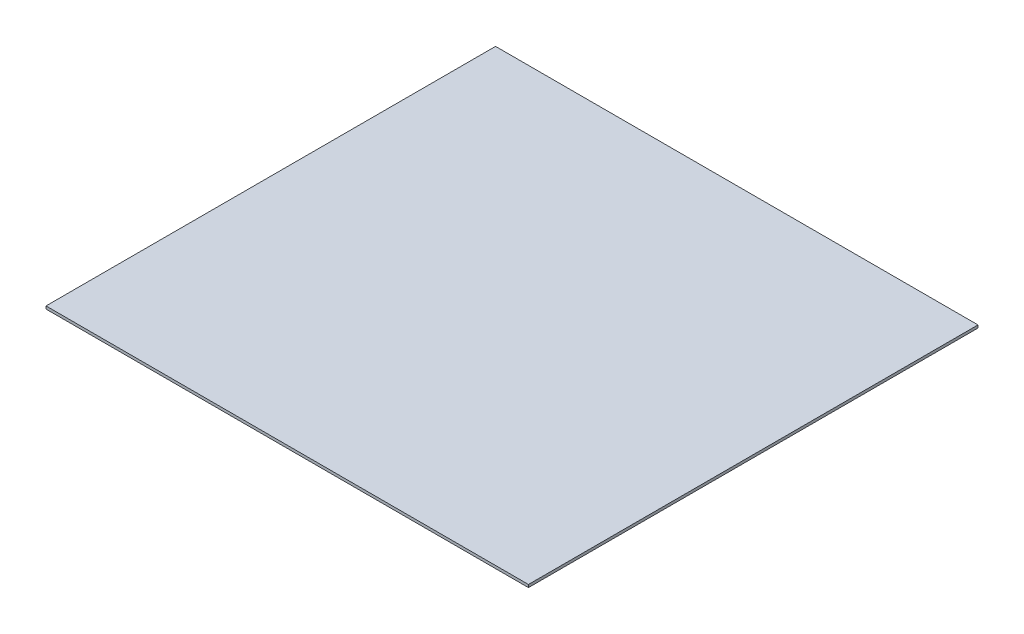
ISO-10303-21;
HEADER;
FILE_DESCRIPTION(('STEP AP214'),'2;1');
FILE_NAME('part.step','',(''),(''),'','','');
FILE_SCHEMA(('AUTOMOTIVE_DESIGN { 1 0 10303 214 1 1 1 1 }'));
ENDSEC;
DATA;
#1=APPLICATION_CONTEXT('core data for automotive mechanical design processes');
#2=APPLICATION_PROTOCOL_DEFINITION('international standard','automotive_design',2000,#1);
#3=PRODUCT_CONTEXT('',#1,'mechanical');
#4=PRODUCT('Part','Part','',(#3));
#5=PRODUCT_RELATED_PRODUCT_CATEGORY('part','',(#4));
#6=PRODUCT_DEFINITION_FORMATION('','',#4);
#7=PRODUCT_DEFINITION_CONTEXT('part definition',#1,'design');
#8=PRODUCT_DEFINITION('design','',#6,#7);
#9=PRODUCT_DEFINITION_SHAPE('','',#8);
#10=(LENGTH_UNIT() NAMED_UNIT(*) SI_UNIT(.MILLI.,.METRE.));
#11=(NAMED_UNIT(*) PLANE_ANGLE_UNIT() SI_UNIT($,.RADIAN.));
#12=(NAMED_UNIT(*) SI_UNIT($,.STERADIAN.) SOLID_ANGLE_UNIT());
#13=UNCERTAINTY_MEASURE_WITH_UNIT(LENGTH_MEASURE(1.E-05),#10,'distance_accuracy_value','');
#14=(GEOMETRIC_REPRESENTATION_CONTEXT(3) GLOBAL_UNCERTAINTY_ASSIGNED_CONTEXT((#13)) GLOBAL_UNIT_ASSIGNED_CONTEXT((#10,
#11,#12)) REPRESENTATION_CONTEXT('',''));
#15=CARTESIAN_POINT('',(0.,0.,0.));
#16=DIRECTION('',(0.,0.,1.));
#17=DIRECTION('',(1.,0.,0.));
#18=AXIS2_PLACEMENT_3D('',#15,#16,#17);
#19=CARTESIAN_POINT('',(0.,76.2,0.));
#20=DIRECTION('',(1.,0.,0.));
#21=DIRECTION('',(0.,0.,-1.));
#22=AXIS2_PLACEMENT_3D('',#19,#20,#21);
#23=PLANE('',#22);
#24=DIRECTION('',(0.,0.,1.));
#25=VECTOR('',#24,1.);
#26=CARTESIAN_POINT('',(0.,0.,0.));
#27=LINE('',#26,#25);
#28=CARTESIAN_POINT('',(0.,0.,-12496.8));
#29=VERTEX_POINT('',#28);
#30=CARTESIAN_POINT('',(0.,0.,0.));
#31=VERTEX_POINT('',#30);
#32=EDGE_CURVE('E107',#29,#31,#27,.T.);
#33=ORIENTED_EDGE('',*,*,#32,.T.);
#34=DIRECTION('',(0.,-1.,0.));
#35=VECTOR('',#34,1.);
#36=CARTESIAN_POINT('',(0.,76.2,0.));
#37=LINE('',#36,#35);
#38=CARTESIAN_POINT('',(0.,76.2,0.));
#39=VERTEX_POINT('',#38);
#40=EDGE_CURVE('E11',#39,#31,#37,.T.);
#41=ORIENTED_EDGE('',*,*,#40,.F.);
#42=DIRECTION('',(0.,0.,1.));
#43=VECTOR('',#42,1.);
#44=CARTESIAN_POINT('',(0.,76.2,0.));
#45=LINE('',#44,#43);
#46=CARTESIAN_POINT('',(0.,76.2,-12496.8));
#47=VERTEX_POINT('',#46);
#48=EDGE_CURVE('E91',#47,#39,#45,.T.);
#49=ORIENTED_EDGE('',*,*,#48,.F.);
#50=DIRECTION('',(0.,-1.,0.));
#51=VECTOR('',#50,1.);
#52=CARTESIAN_POINT('',(0.,76.2,-12496.8));
#53=LINE('',#52,#51);
#54=EDGE_CURVE('E103',#47,#29,#53,.T.);
#55=ORIENTED_EDGE('',*,*,#54,.T.);
#56=EDGE_LOOP('',(#33,#41,#49,#55));
#57=FACE_BOUND('',#56,.T.);
#58=ADVANCED_FACE('F39',(#57),#23,.F.);
#59=CARTESIAN_POINT('',(0.,76.2,0.));
#60=DIRECTION('',(0.,0.,-1.));
#61=DIRECTION('',(-1.,0.,0.));
#62=AXIS2_PLACEMENT_3D('',#59,#60,#61);
#63=PLANE('',#62);
#64=DIRECTION('',(1.,0.,0.));
#65=VECTOR('',#64,1.);
#66=CARTESIAN_POINT('',(0.,0.,0.));
#67=LINE('',#66,#65);
#68=CARTESIAN_POINT('',(13411.2,0.,0.));
#69=VERTEX_POINT('',#68);
#70=EDGE_CURVE('E96',#31,#69,#67,.T.);
#71=ORIENTED_EDGE('',*,*,#70,.T.);
#72=DIRECTION('',(0.,-1.,0.));
#73=VECTOR('',#72,1.);
#74=CARTESIAN_POINT('',(13411.2,76.2,0.));
#75=LINE('',#74,#73);
#76=CARTESIAN_POINT('',(13411.2,76.2,0.));
#77=VERTEX_POINT('',#76);
#78=EDGE_CURVE('E48',#77,#69,#75,.T.);
#79=ORIENTED_EDGE('',*,*,#78,.F.);
#80=DIRECTION('',(1.,0.,0.));
#81=VECTOR('',#80,1.);
#82=CARTESIAN_POINT('',(0.,76.2,0.));
#83=LINE('',#82,#81);
#84=EDGE_CURVE('E86',#39,#77,#83,.T.);
#85=ORIENTED_EDGE('',*,*,#84,.F.);
#86=ORIENTED_EDGE('',*,*,#40,.T.);
#87=EDGE_LOOP('',(#71,#79,#85,#86));
#88=FACE_BOUND('',#87,.T.);
#89=ADVANCED_FACE('F95',(#88),#63,.F.);
#90=CARTESIAN_POINT('',(13411.2,76.2,0.));
#91=DIRECTION('',(-1.,0.,0.));
#92=DIRECTION('',(0.,0.,1.));
#93=AXIS2_PLACEMENT_3D('',#90,#91,#92);
#94=PLANE('',#93);
#95=DIRECTION('',(0.,0.,-1.));
#96=VECTOR('',#95,1.);
#97=CARTESIAN_POINT('',(13411.2,0.,0.));
#98=LINE('',#97,#96);
#99=CARTESIAN_POINT('',(13411.2,0.,-12496.8));
#100=VERTEX_POINT('',#99);
#101=EDGE_CURVE('E73',#69,#100,#98,.T.);
#102=ORIENTED_EDGE('',*,*,#101,.T.);
#103=DIRECTION('',(0.,-1.,0.));
#104=VECTOR('',#103,1.);
#105=CARTESIAN_POINT('',(13411.2,76.2,-12496.8));
#106=LINE('',#105,#104);
#107=CARTESIAN_POINT('',(13411.2,76.2,-12496.8));
#108=VERTEX_POINT('',#107);
#109=EDGE_CURVE('E98',#108,#100,#106,.T.);
#110=ORIENTED_EDGE('',*,*,#109,.F.);
#111=DIRECTION('',(0.,0.,-1.));
#112=VECTOR('',#111,1.);
#113=CARTESIAN_POINT('',(13411.2,76.2,0.));
#114=LINE('',#113,#112);
#115=EDGE_CURVE('E89',#77,#108,#114,.T.);
#116=ORIENTED_EDGE('',*,*,#115,.F.);
#117=ORIENTED_EDGE('',*,*,#78,.T.);
#118=EDGE_LOOP('',(#102,#110,#116,#117));
#119=FACE_BOUND('',#118,.T.);
#120=ADVANCED_FACE('F99',(#119),#94,.F.);
#121=CARTESIAN_POINT('',(0.,76.2,-12496.8));
#122=DIRECTION('',(0.,0.,1.));
#123=DIRECTION('',(1.,0.,0.));
#124=AXIS2_PLACEMENT_3D('',#121,#122,#123);
#125=PLANE('',#124);
#126=DIRECTION('',(-1.,0.,0.));
#127=VECTOR('',#126,1.);
#128=CARTESIAN_POINT('',(0.,0.,-12496.8));
#129=LINE('',#128,#127);
#130=EDGE_CURVE('E79',#100,#29,#129,.T.);
#131=ORIENTED_EDGE('',*,*,#130,.T.);
#132=ORIENTED_EDGE('',*,*,#54,.F.);
#133=DIRECTION('',(-1.,0.,0.));
#134=VECTOR('',#133,1.);
#135=CARTESIAN_POINT('',(0.,76.2,-12496.8));
#136=LINE('',#135,#134);
#137=EDGE_CURVE('E56',#108,#47,#136,.T.);
#138=ORIENTED_EDGE('',*,*,#137,.F.);
#139=ORIENTED_EDGE('',*,*,#109,.T.);
#140=EDGE_LOOP('',(#131,#132,#138,#139));
#141=FACE_BOUND('',#140,.T.);
#142=ADVANCED_FACE('F120',(#141),#125,.F.);
#143=CARTESIAN_POINT('',(0.,76.2,0.));
#144=DIRECTION('',(0.,-1.,0.));
#145=DIRECTION('',(0.,0.,-1.));
#146=AXIS2_PLACEMENT_3D('',#143,#144,#145);
#147=PLANE('',#146);
#148=ORIENTED_EDGE('',*,*,#48,.T.);
#149=ORIENTED_EDGE('',*,*,#84,.T.);
#150=ORIENTED_EDGE('',*,*,#115,.T.);
#151=ORIENTED_EDGE('',*,*,#137,.T.);
#152=EDGE_LOOP('',(#148,#149,#150,#151));
#153=FACE_BOUND('',#152,.T.);
#154=ADVANCED_FACE('F87',(#153),#147,.F.);
#155=CARTESIAN_POINT('',(0.,0.,0.));
#156=DIRECTION('',(0.,-1.,0.));
#157=DIRECTION('',(0.,0.,-1.));
#158=AXIS2_PLACEMENT_3D('',#155,#156,#157);
#159=PLANE('',#158);
#160=ORIENTED_EDGE('',*,*,#32,.F.);
#161=ORIENTED_EDGE('',*,*,#130,.F.);
#162=ORIENTED_EDGE('',*,*,#101,.F.);
#163=ORIENTED_EDGE('',*,*,#70,.F.);
#164=EDGE_LOOP('',(#160,#161,#162,#163));
#165=FACE_BOUND('',#164,.T.);
#166=ADVANCED_FACE('F123',(#165),#159,.T.);
#167=CLOSED_SHELL('',(#58,#89,#120,#142,#154,#166));
#168=MANIFOLD_SOLID_BREP('B2',#167);
#169=ADVANCED_BREP_SHAPE_REPRESENTATION('',(#18,#168),#14);
#170=SHAPE_DEFINITION_REPRESENTATION(#9,#169);
ENDSEC;
END-ISO-10303-21;
